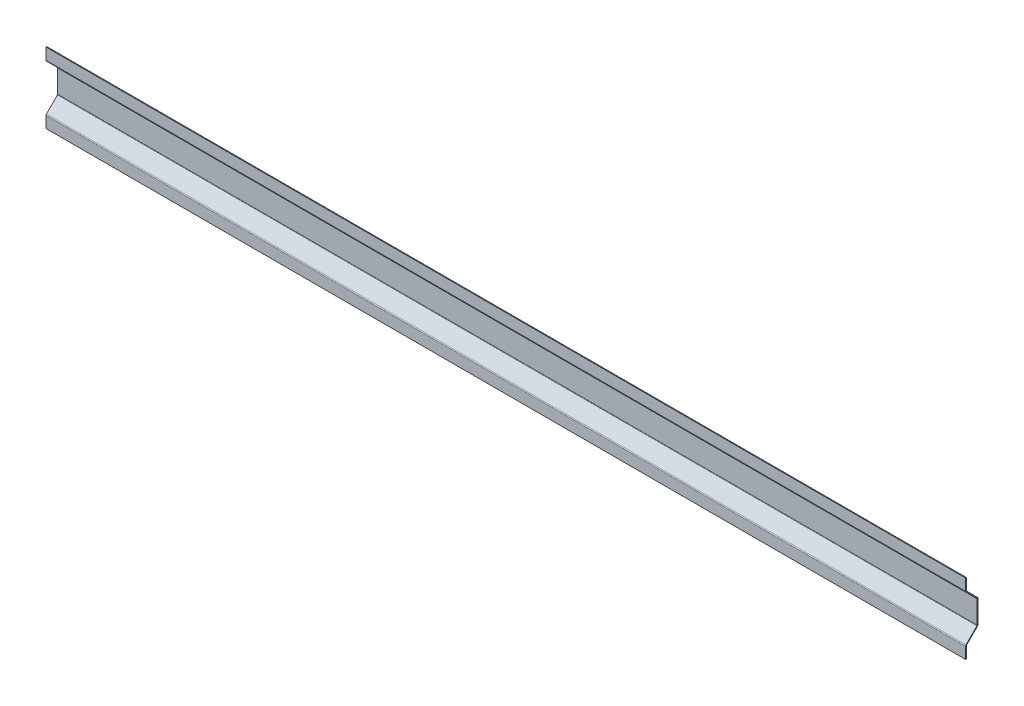
ISO-10303-21;
HEADER;
FILE_DESCRIPTION(('STEP AP214'),'2;1');
FILE_NAME('part.step','',(''),(''),'','','');
FILE_SCHEMA(('AUTOMOTIVE_DESIGN { 1 0 10303 214 1 1 1 1 }'));
ENDSEC;
DATA;
#1=APPLICATION_CONTEXT('core data for automotive mechanical design processes');
#2=APPLICATION_PROTOCOL_DEFINITION('international standard','automotive_design',2000,#1);
#3=PRODUCT_CONTEXT('',#1,'mechanical');
#4=PRODUCT('Part','Part','',(#3));
#5=PRODUCT_RELATED_PRODUCT_CATEGORY('part','',(#4));
#6=PRODUCT_DEFINITION_FORMATION('','',#4);
#7=PRODUCT_DEFINITION_CONTEXT('part definition',#1,'design');
#8=PRODUCT_DEFINITION('design','',#6,#7);
#9=PRODUCT_DEFINITION_SHAPE('','',#8);
#10=(LENGTH_UNIT() NAMED_UNIT(*) SI_UNIT(.MILLI.,.METRE.));
#11=(NAMED_UNIT(*) PLANE_ANGLE_UNIT() SI_UNIT($,.RADIAN.));
#12=(NAMED_UNIT(*) SI_UNIT($,.STERADIAN.) SOLID_ANGLE_UNIT());
#13=UNCERTAINTY_MEASURE_WITH_UNIT(LENGTH_MEASURE(1.E-05),#10,'distance_accuracy_value','');
#14=(GEOMETRIC_REPRESENTATION_CONTEXT(3) GLOBAL_UNCERTAINTY_ASSIGNED_CONTEXT((#13)) GLOBAL_UNIT_ASSIGNED_CONTEXT((#10,
#11,#12)) REPRESENTATION_CONTEXT('',''));
#15=CARTESIAN_POINT('',(0.,0.,0.));
#16=DIRECTION('',(0.,0.,1.));
#17=DIRECTION('',(1.,0.,0.));
#18=AXIS2_PLACEMENT_3D('',#15,#16,#17);
#19=CARTESIAN_POINT('',(575.,-30.5563491861042,14.5563491861037));
#20=DIRECTION('',(-1.,0.,0.));
#21=DIRECTION('',(0.,0.,1.));
#22=AXIS2_PLACEMENT_3D('',#19,#20,#21);
#23=PLANE('',#22);
#24=DIRECTION('',(0.,0.707106781186545,0.70710678118655));
#25=VECTOR('',#24,1.);
#26=CARTESIAN_POINT('',(575.,-29.2634559672906,13.2634559672902));
#27=LINE('',#26,#25);
#28=CARTESIAN_POINT('',(575.,-29.2634559672906,13.2634559672902));
#29=VERTEX_POINT('',#28);
#30=CARTESIAN_POINT('',(575.,-28.5563491861042,13.9705627484767));
#31=VERTEX_POINT('',#30);
#32=EDGE_CURVE('E310',#29,#31,#27,.T.);
#33=ORIENTED_EDGE('',*,*,#32,.F.);
#34=DIRECTION('',(0.,-0.707106781186551,0.707106781186544));
#35=VECTOR('',#34,1.);
#36=CARTESIAN_POINT('',(575.,-7.29289321881343,-8.7071067811868));
#37=LINE('',#36,#35);
#38=CARTESIAN_POINT('',(575.,-15.585786437627,-0.414213562373367));
#39=VERTEX_POINT('',#38);
#40=EDGE_CURVE('E412',#39,#29,#37,.T.);
#41=ORIENTED_EDGE('',*,*,#40,.F.);
#42=DIRECTION('',(0.,0.707106781186544,0.707106781186551));
#43=VECTOR('',#42,1.);
#44=CARTESIAN_POINT('',(575.,-14.8786796564404,0.292893218813095));
#45=LINE('',#44,#43);
#46=CARTESIAN_POINT('',(575.,-14.8786796564404,0.292893218813206));
#47=VERTEX_POINT('',#46);
#48=EDGE_CURVE('E423',#47,#39,#45,.F.);
#49=ORIENTED_EDGE('',*,*,#48,.F.);
#50=DIRECTION('',(0.,0.707106781186551,-0.707106781186544));
#51=VECTOR('',#50,1.);
#52=CARTESIAN_POINT('',(575.,-29.8492424049176,15.2634559672902));
#53=LINE('',#52,#51);
#54=EDGE_CURVE('E417',#47,#31,#53,.F.);
#55=ORIENTED_EDGE('',*,*,#54,.T.);
#56=EDGE_LOOP('',(#33,#41,#49,#55));
#57=FACE_BOUND('',#56,.T.);
#58=ADVANCED_FACE('F114',(#57),#23,.F.);
#59=CARTESIAN_POINT('',(-575.,-15.2928932188138,-0.707106781186573));
#60=DIRECTION('',(1.,0.,0.));
#61=DIRECTION('',(0.,0.,-1.));
#62=AXIS2_PLACEMENT_3D('',#59,#60,#61);
#63=PLANE('',#62);
#64=DIRECTION('',(0.,0.707106781186545,0.70710678118655));
#65=VECTOR('',#64,1.);
#66=CARTESIAN_POINT('',(-575.,-29.2634559672909,13.2634559672905));
#67=LINE('',#66,#65);
#68=CARTESIAN_POINT('',(-575.,-29.2634559672909,13.2634559672905));
#69=VERTEX_POINT('',#68);
#70=CARTESIAN_POINT('',(-575.,-28.5563491861044,13.970562748477));
#71=VERTEX_POINT('',#70);
#72=EDGE_CURVE('E299',#69,#71,#67,.T.);
#73=ORIENTED_EDGE('',*,*,#72,.T.);
#74=DIRECTION('',(0.,-0.707106781186551,0.707106781186544));
#75=VECTOR('',#74,1.);
#76=CARTESIAN_POINT('',(-575.,-14.5857864376272,0.));
#77=LINE('',#76,#75);
#78=CARTESIAN_POINT('',(-575.,-14.8786796564406,0.292893218813428));
#79=VERTEX_POINT('',#78);
#80=EDGE_CURVE('E415',#71,#79,#77,.F.);
#81=ORIENTED_EDGE('',*,*,#80,.T.);
#82=DIRECTION('',(0.,0.707106781186544,0.707106781186551));
#83=VECTOR('',#82,1.);
#84=CARTESIAN_POINT('',(-575.,-15.5857864376272,-0.414213562373145));
#85=LINE('',#84,#83);
#86=CARTESIAN_POINT('',(-575.,-15.5857864376272,-0.414213562373145));
#87=VERTEX_POINT('',#86);
#88=EDGE_CURVE('E406',#79,#87,#85,.F.);
#89=ORIENTED_EDGE('',*,*,#88,.T.);
#90=DIRECTION('',(0.,0.707106781186551,-0.707106781186544));
#91=VECTOR('',#90,1.);
#92=CARTESIAN_POINT('',(-575.,-7.29289321881366,-8.70710678118658));
#93=LINE('',#92,#91);
#94=EDGE_CURVE('E409',#69,#87,#93,.T.);
#95=ORIENTED_EDGE('',*,*,#94,.F.);
#96=EDGE_LOOP('',(#73,#81,#89,#95));
#97=FACE_BOUND('',#96,.T.);
#98=ADVANCED_FACE('F533',(#97),#63,.F.);
#99=CARTESIAN_POINT('',(0.,-7.29289321881332,-8.70710678118658));
#100=DIRECTION('',(0.,0.707106781186544,0.707106781186551));
#101=DIRECTION('',(0.,-0.707106781186551,0.707106781186544));
#102=AXIS2_PLACEMENT_3D('',#99,#100,#101);
#103=PLANE('',#102);
#104=DIRECTION('',(-1.,0.,0.));
#105=VECTOR('',#104,1.);
#106=CARTESIAN_POINT('',(-575.,-29.2634559672909,13.2634559672905));
#107=LINE('',#106,#105);
#108=EDGE_CURVE('E305',#69,#29,#107,.F.);
#109=ORIENTED_EDGE('',*,*,#108,.F.);
#110=ORIENTED_EDGE('',*,*,#94,.T.);
#111=DIRECTION('',(1.,0.,0.));
#112=VECTOR('',#111,1.);
#113=CARTESIAN_POINT('',(-575.,-15.5857864376272,-0.414213562373145));
#114=LINE('',#113,#112);
#115=EDGE_CURVE('E420',#39,#87,#114,.F.);
#116=ORIENTED_EDGE('',*,*,#115,.F.);
#117=ORIENTED_EDGE('',*,*,#40,.T.);
#118=EDGE_LOOP('',(#109,#110,#116,#117));
#119=FACE_BOUND('',#118,.T.);
#120=ADVANCED_FACE('F487',(#119),#103,.F.);
#121=CARTESIAN_POINT('',(0.,-6.58578643762686,-8.00000000000001));
#122=DIRECTION('',(0.,0.707106781186544,0.707106781186551));
#123=DIRECTION('',(0.,-0.707106781186551,0.707106781186544));
#124=AXIS2_PLACEMENT_3D('',#121,#122,#123);
#125=PLANE('',#124);
#126=ORIENTED_EDGE('',*,*,#80,.F.);
#127=DIRECTION('',(-1.,0.,0.));
#128=VECTOR('',#127,1.);
#129=CARTESIAN_POINT('',(-575.,-28.5563491861044,13.970562748477));
#130=LINE('',#129,#128);
#131=EDGE_CURVE('E294',#71,#31,#130,.F.);
#132=ORIENTED_EDGE('',*,*,#131,.T.);
#133=ORIENTED_EDGE('',*,*,#54,.F.);
#134=DIRECTION('',(1.,0.,0.));
#135=VECTOR('',#134,1.);
#136=CARTESIAN_POINT('',(-575.,-14.8786796564406,0.292893218813428));
#137=LINE('',#136,#135);
#138=EDGE_CURVE('E426',#79,#47,#137,.T.);
#139=ORIENTED_EDGE('',*,*,#138,.F.);
#140=EDGE_LOOP('',(#126,#132,#133,#139));
#141=FACE_BOUND('',#140,.T.);
#142=ADVANCED_FACE('F477',(#141),#125,.T.);
#143=CARTESIAN_POINT('',(575.,15.2928932188134,-0.707106781186795));
#144=DIRECTION('',(-1.,0.,0.));
#145=DIRECTION('',(0.,0.,1.));
#146=AXIS2_PLACEMENT_3D('',#143,#144,#145);
#147=PLANE('',#146);
#148=DIRECTION('',(0.,-0.707106781186545,0.70710678118655));
#149=VECTOR('',#148,1.);
#150=CARTESIAN_POINT('',(575.,29.2634559672906,13.2634559672902));
#151=LINE('',#150,#149);
#152=CARTESIAN_POINT('',(575.,29.2634559672906,13.2634559672902));
#153=VERTEX_POINT('',#152);
#154=CARTESIAN_POINT('',(575.,28.5563491861041,13.9705627484767));
#155=VERTEX_POINT('',#154);
#156=EDGE_CURVE('E350',#153,#155,#151,.T.);
#157=ORIENTED_EDGE('',*,*,#156,.T.);
#158=DIRECTION('',(0.,0.707106781186551,0.707106781186544));
#159=VECTOR('',#158,1.);
#160=CARTESIAN_POINT('',(575.,14.5857864376269,-3.33066907387547E-13));
#161=LINE('',#160,#159);
#162=CARTESIAN_POINT('',(575.,14.8786796564403,0.292893218813206));
#163=VERTEX_POINT('',#162);
#164=EDGE_CURVE('E374',#155,#163,#161,.F.);
#165=ORIENTED_EDGE('',*,*,#164,.T.);
#166=DIRECTION('',(0.,-0.707106781186544,0.707106781186551));
#167=VECTOR('',#166,1.);
#168=CARTESIAN_POINT('',(575.,15.5857864376269,-0.414213562373367));
#169=LINE('',#168,#167);
#170=CARTESIAN_POINT('',(575.,15.5857864376269,-0.414213562373367));
#171=VERTEX_POINT('',#170);
#172=EDGE_CURVE('E362',#163,#171,#169,.F.);
#173=ORIENTED_EDGE('',*,*,#172,.T.);
#174=DIRECTION('',(0.,-0.707106781186551,-0.707106781186544));
#175=VECTOR('',#174,1.);
#176=CARTESIAN_POINT('',(575.,7.29289321881332,-8.7071067811868));
#177=LINE('',#176,#175);
#178=EDGE_CURVE('E369',#153,#171,#177,.T.);
#179=ORIENTED_EDGE('',*,*,#178,.F.);
#180=EDGE_LOOP('',(#157,#165,#173,#179));
#181=FACE_BOUND('',#180,.T.);
#182=ADVANCED_FACE('F838',(#181),#147,.F.);
#183=CARTESIAN_POINT('',(-575.,30.5563491861038,14.5563491861039));
#184=DIRECTION('',(1.,0.,0.));
#185=DIRECTION('',(0.,0.,-1.));
#186=AXIS2_PLACEMENT_3D('',#183,#184,#185);
#187=PLANE('',#186);
#188=DIRECTION('',(0.,-0.707106781186545,0.70710678118655));
#189=VECTOR('',#188,1.);
#190=CARTESIAN_POINT('',(-575.,29.2634559672903,13.2634559672905));
#191=LINE('',#190,#189);
#192=CARTESIAN_POINT('',(-575.,29.2634559672903,13.2634559672905));
#193=VERTEX_POINT('',#192);
#194=CARTESIAN_POINT('',(-575.,28.5563491861038,13.970562748477));
#195=VERTEX_POINT('',#194);
#196=EDGE_CURVE('E360',#193,#195,#191,.T.);
#197=ORIENTED_EDGE('',*,*,#196,.F.);
#198=DIRECTION('',(0.,0.707106781186551,0.707106781186544));
#199=VECTOR('',#198,1.);
#200=CARTESIAN_POINT('',(-575.,7.2928932188131,-8.70710678118658));
#201=LINE('',#200,#199);
#202=CARTESIAN_POINT('',(-575.,15.5857864376266,-0.414213562373145));
#203=VERTEX_POINT('',#202);
#204=EDGE_CURVE('E365',#203,#193,#201,.T.);
#205=ORIENTED_EDGE('',*,*,#204,.F.);
#206=DIRECTION('',(0.,-0.707106781186544,0.707106781186551));
#207=VECTOR('',#206,1.);
#208=CARTESIAN_POINT('',(-575.,14.8786796564401,0.292893218813428));
#209=LINE('',#208,#207);
#210=CARTESIAN_POINT('',(-575.,14.8786796564401,0.292893218813428));
#211=VERTEX_POINT('',#210);
#212=EDGE_CURVE('E379',#211,#203,#209,.F.);
#213=ORIENTED_EDGE('',*,*,#212,.F.);
#214=DIRECTION('',(0.,-0.707106781186551,-0.707106781186544));
#215=VECTOR('',#214,1.);
#216=CARTESIAN_POINT('',(-575.,29.8492424049173,15.2634559672905));
#217=LINE('',#216,#215);
#218=EDGE_CURVE('E371',#211,#195,#217,.F.);
#219=ORIENTED_EDGE('',*,*,#218,.T.);
#220=EDGE_LOOP('',(#197,#205,#213,#219));
#221=FACE_BOUND('',#220,.T.);
#222=ADVANCED_FACE('F511',(#221),#187,.F.);
#223=CARTESIAN_POINT('',(0.,7.29289321881332,-8.70710678118658));
#224=DIRECTION('',(0.,-0.707106781186544,0.707106781186551));
#225=DIRECTION('',(0.,-0.707106781186551,-0.707106781186544));
#226=AXIS2_PLACEMENT_3D('',#223,#224,#225);
#227=PLANE('',#226);
#228=DIRECTION('',(1.,0.,0.));
#229=VECTOR('',#228,1.);
#230=CARTESIAN_POINT('',(575.,29.2634559672906,13.2634559672902));
#231=LINE('',#230,#229);
#232=EDGE_CURVE('E356',#153,#193,#231,.F.);
#233=ORIENTED_EDGE('',*,*,#232,.F.);
#234=ORIENTED_EDGE('',*,*,#178,.T.);
#235=DIRECTION('',(-1.,0.,0.));
#236=VECTOR('',#235,1.);
#237=CARTESIAN_POINT('',(575.,15.5857864376269,-0.414213562373367));
#238=LINE('',#237,#236);
#239=EDGE_CURVE('E376',#203,#171,#238,.F.);
#240=ORIENTED_EDGE('',*,*,#239,.F.);
#241=ORIENTED_EDGE('',*,*,#204,.T.);
#242=EDGE_LOOP('',(#233,#234,#240,#241));
#243=FACE_BOUND('',#242,.T.);
#244=ADVANCED_FACE('F518',(#243),#227,.F.);
#245=CARTESIAN_POINT('',(0.,6.58578643762686,-8.00000000000001));
#246=DIRECTION('',(0.,-0.707106781186544,0.707106781186551));
#247=DIRECTION('',(0.,-0.707106781186551,-0.707106781186544));
#248=AXIS2_PLACEMENT_3D('',#245,#246,#247);
#249=PLANE('',#248);
#250=ORIENTED_EDGE('',*,*,#164,.F.);
#251=DIRECTION('',(1.,0.,0.));
#252=VECTOR('',#251,1.);
#253=CARTESIAN_POINT('',(575.,28.5563491861041,13.9705627484767));
#254=LINE('',#253,#252);
#255=EDGE_CURVE('E345',#155,#195,#254,.F.);
#256=ORIENTED_EDGE('',*,*,#255,.T.);
#257=ORIENTED_EDGE('',*,*,#218,.F.);
#258=DIRECTION('',(-1.,0.,0.));
#259=VECTOR('',#258,1.);
#260=CARTESIAN_POINT('',(575.,14.8786796564403,0.292893218813206));
#261=LINE('',#260,#259);
#262=EDGE_CURVE('E382',#163,#211,#261,.T.);
#263=ORIENTED_EDGE('',*,*,#262,.F.);
#264=EDGE_LOOP('',(#250,#256,#257,#263));
#265=FACE_BOUND('',#264,.T.);
#266=ADVANCED_FACE('F507',(#265),#249,.T.);
#267=CARTESIAN_POINT('',(0.,0.,-1.));
#268=DIRECTION('',(0.,0.,-1.));
#269=DIRECTION('',(-1.,0.,0.));
#270=AXIS2_PLACEMENT_3D('',#267,#268,#269);
#271=PLANE('',#270);
#272=DIRECTION('',(0.,-1.,0.));
#273=VECTOR('',#272,1.);
#274=CARTESIAN_POINT('',(-575.,-16.0000000000002,-1.));
#275=LINE('',#274,#273);
#276=CARTESIAN_POINT('',(-575.,14.1715728752535,-1.));
#277=VERTEX_POINT('',#276);
#278=CARTESIAN_POINT('',(-575.,-14.1715728752541,-1.));
#279=VERTEX_POINT('',#278);
#280=EDGE_CURVE('E13',#277,#279,#275,.T.);
#281=ORIENTED_EDGE('',*,*,#280,.F.);
#282=DIRECTION('',(-1.,0.,0.));
#283=VECTOR('',#282,1.);
#284=CARTESIAN_POINT('',(-575.,14.1715728752535,-1.));
#285=LINE('',#284,#283);
#286=CARTESIAN_POINT('',(575.,14.1715728752537,-1.00000000000033));
#287=VERTEX_POINT('',#286);
#288=EDGE_CURVE('E386',#277,#287,#285,.F.);
#289=ORIENTED_EDGE('',*,*,#288,.T.);
#290=DIRECTION('',(0.,1.,0.));
#291=VECTOR('',#290,1.);
#292=CARTESIAN_POINT('',(575.,-16.,-1.00000000000033));
#293=LINE('',#292,#291);
#294=CARTESIAN_POINT('',(575.,-14.1715728752538,-1.00000000000033));
#295=VERTEX_POINT('',#294);
#296=EDGE_CURVE('E123',#295,#287,#293,.T.);
#297=ORIENTED_EDGE('',*,*,#296,.F.);
#298=DIRECTION('',(1.,0.,0.));
#299=VECTOR('',#298,1.);
#300=CARTESIAN_POINT('',(575.,-14.1715728752538,-1.00000000000033));
#301=LINE('',#300,#299);
#302=EDGE_CURVE('E430',#295,#279,#301,.F.);
#303=ORIENTED_EDGE('',*,*,#302,.T.);
#304=EDGE_LOOP('',(#281,#289,#297,#303));
#305=FACE_BOUND('',#304,.T.);
#306=ADVANCED_FACE('F493',(#305),#271,.T.);
#307=CARTESIAN_POINT('',(0.,0.,0.));
#308=DIRECTION('',(0.,0.,-1.));
#309=DIRECTION('',(-1.,0.,0.));
#310=AXIS2_PLACEMENT_3D('',#307,#308,#309);
#311=PLANE('',#310);
#312=DIRECTION('',(-1.,0.,0.));
#313=VECTOR('',#312,1.);
#314=CARTESIAN_POINT('',(-575.,14.1715728752535,0.));
#315=LINE('',#314,#313);
#316=CARTESIAN_POINT('',(-575.,14.1715728752535,0.));
#317=VERTEX_POINT('',#316);
#318=CARTESIAN_POINT('',(575.,14.1715728752537,-3.33066907387547E-13));
#319=VERTEX_POINT('',#318);
#320=EDGE_CURVE('E399',#317,#319,#315,.F.);
#321=ORIENTED_EDGE('',*,*,#320,.F.);
#322=DIRECTION('',(0.,-1.,0.));
#323=VECTOR('',#322,1.);
#324=CARTESIAN_POINT('',(-575.,-16.0000000000002,0.));
#325=LINE('',#324,#323);
#326=CARTESIAN_POINT('',(-575.,-14.1715728752541,0.));
#327=VERTEX_POINT('',#326);
#328=EDGE_CURVE('E118',#317,#327,#325,.T.);
#329=ORIENTED_EDGE('',*,*,#328,.T.);
#330=DIRECTION('',(1.,0.,0.));
#331=VECTOR('',#330,1.);
#332=CARTESIAN_POINT('',(575.,-14.1715728752538,-3.33066907387547E-13));
#333=LINE('',#332,#331);
#334=CARTESIAN_POINT('',(575.,-14.1715728752538,-3.33066907387547E-13));
#335=VERTEX_POINT('',#334);
#336=EDGE_CURVE('E443',#335,#327,#333,.F.);
#337=ORIENTED_EDGE('',*,*,#336,.F.);
#338=DIRECTION('',(0.,1.,0.));
#339=VECTOR('',#338,1.);
#340=CARTESIAN_POINT('',(575.,-16.,-3.33066907387547E-13));
#341=LINE('',#340,#339);
#342=EDGE_CURVE('E450',#335,#319,#341,.T.);
#343=ORIENTED_EDGE('',*,*,#342,.T.);
#344=EDGE_LOOP('',(#321,#329,#337,#343));
#345=FACE_BOUND('',#344,.T.);
#346=ADVANCED_FACE('F462',(#345),#311,.F.);
#347=CARTESIAN_POINT('',(-575.,-16.0000000000002,-1.));
#348=DIRECTION('',(-1.,0.,0.));
#349=DIRECTION('',(0.,0.,1.));
#350=AXIS2_PLACEMENT_3D('',#347,#348,#349);
#351=PLANE('',#350);
#352=ORIENTED_EDGE('',*,*,#328,.F.);
#353=DIRECTION('',(0.,0.,-1.));
#354=VECTOR('',#353,1.);
#355=CARTESIAN_POINT('',(-575.,14.1715728752535,0.));
#356=LINE('',#355,#354);
#357=EDGE_CURVE('E393',#317,#277,#356,.T.);
#358=ORIENTED_EDGE('',*,*,#357,.T.);
#359=ORIENTED_EDGE('',*,*,#280,.T.);
#360=DIRECTION('',(0.,0.,-1.));
#361=VECTOR('',#360,1.);
#362=CARTESIAN_POINT('',(-575.,-14.1715728752541,0.));
#363=LINE('',#362,#361);
#364=EDGE_CURVE('E447',#327,#279,#363,.T.);
#365=ORIENTED_EDGE('',*,*,#364,.F.);
#366=EDGE_LOOP('',(#352,#358,#359,#365));
#367=FACE_BOUND('',#366,.T.);
#368=ADVANCED_FACE('F464',(#367),#351,.T.);
#369=CARTESIAN_POINT('',(575.,-16.,-1.00000000000033));
#370=DIRECTION('',(1.,0.,0.));
#371=DIRECTION('',(0.,0.,-1.));
#372=AXIS2_PLACEMENT_3D('',#369,#370,#371);
#373=PLANE('',#372);
#374=DIRECTION('',(0.,0.,-1.));
#375=VECTOR('',#374,1.);
#376=CARTESIAN_POINT('',(575.,14.1715728752537,-3.33066907387547E-13));
#377=LINE('',#376,#375);
#378=EDGE_CURVE('E403',#319,#287,#377,.T.);
#379=ORIENTED_EDGE('',*,*,#378,.F.);
#380=ORIENTED_EDGE('',*,*,#342,.F.);
#381=DIRECTION('',(0.,0.,-1.));
#382=VECTOR('',#381,1.);
#383=CARTESIAN_POINT('',(575.,-14.1715728752538,-3.33066907387547E-13));
#384=LINE('',#383,#382);
#385=EDGE_CURVE('E437',#335,#295,#384,.T.);
#386=ORIENTED_EDGE('',*,*,#385,.T.);
#387=ORIENTED_EDGE('',*,*,#296,.T.);
#388=EDGE_LOOP('',(#379,#380,#386,#387));
#389=FACE_BOUND('',#388,.T.);
#390=ADVANCED_FACE('F116',(#389),#373,.T.);
#391=CARTESIAN_POINT('',(-575.,-14.1715728752541,1.));
#392=DIRECTION('',(-1.,0.,0.));
#393=DIRECTION('',(0.,0.,1.));
#394=AXIS2_PLACEMENT_3D('',#391,#392,#393);
#395=PLANE('',#394);
#396=ORIENTED_EDGE('',*,*,#88,.F.);
#397=CARTESIAN_POINT('',(-575.,-14.1715728752541,1.));
#398=DIRECTION('',(1.,0.,0.));
#399=DIRECTION('',(0.,0.,-1.));
#400=AXIS2_PLACEMENT_3D('',#397,#398,#399);
#401=CIRCLE('',#400,0.999999999999999);
#402=EDGE_CURVE('E440',#327,#79,#401,.F.);
#403=ORIENTED_EDGE('',*,*,#402,.F.);
#404=ORIENTED_EDGE('',*,*,#364,.T.);
#405=CARTESIAN_POINT('',(-575.,-14.1715728752541,1.));
#406=DIRECTION('',(1.,0.,0.));
#407=DIRECTION('',(0.,0.,-1.));
#408=AXIS2_PLACEMENT_3D('',#405,#406,#407);
#409=CIRCLE('',#408,2.);
#410=EDGE_CURVE('E433',#279,#87,#409,.F.);
#411=ORIENTED_EDGE('',*,*,#410,.T.);
#412=EDGE_LOOP('',(#396,#403,#404,#411));
#413=FACE_BOUND('',#412,.T.);
#414=ADVANCED_FACE('F469',(#413),#395,.T.);
#415=CARTESIAN_POINT('',(575.,-14.1715728752538,0.999999999999668));
#416=DIRECTION('',(-1.,0.,0.));
#417=DIRECTION('',(0.,0.,1.));
#418=AXIS2_PLACEMENT_3D('',#415,#416,#417);
#419=PLANE('',#418);
#420=CARTESIAN_POINT('',(575.,-14.1715728752538,0.999999999999668));
#421=DIRECTION('',(1.,0.,0.));
#422=DIRECTION('',(0.,0.,-1.));
#423=AXIS2_PLACEMENT_3D('',#420,#421,#422);
#424=CIRCLE('',#423,0.999999999999999);
#425=EDGE_CURVE('E411',#47,#335,#424,.T.);
#426=ORIENTED_EDGE('',*,*,#425,.F.);
#427=ORIENTED_EDGE('',*,*,#48,.T.);
#428=CARTESIAN_POINT('',(575.,-14.1715728752538,0.999999999999668));
#429=DIRECTION('',(1.,0.,0.));
#430=DIRECTION('',(0.,0.,-1.));
#431=AXIS2_PLACEMENT_3D('',#428,#429,#430);
#432=CIRCLE('',#431,2.);
#433=EDGE_CURVE('E434',#39,#295,#432,.T.);
#434=ORIENTED_EDGE('',*,*,#433,.T.);
#435=ORIENTED_EDGE('',*,*,#385,.F.);
#436=EDGE_LOOP('',(#426,#427,#434,#435));
#437=FACE_BOUND('',#436,.T.);
#438=ADVANCED_FACE('F484',(#437),#419,.F.);
#439=CARTESIAN_POINT('',(575.,-14.1715728752538,0.999999999999668));
#440=DIRECTION('',(1.,0.,0.));
#441=DIRECTION('',(0.,-0.707106781186544,-0.707106781186551));
#442=AXIS2_PLACEMENT_3D('',#439,#440,#441);
#443=CYLINDRICAL_SURFACE('',#442,2.);
#444=ORIENTED_EDGE('',*,*,#302,.F.);
#445=ORIENTED_EDGE('',*,*,#433,.F.);
#446=ORIENTED_EDGE('',*,*,#115,.T.);
#447=ORIENTED_EDGE('',*,*,#410,.F.);
#448=EDGE_LOOP('',(#444,#445,#446,#447));
#449=FACE_BOUND('',#448,.T.);
#450=ADVANCED_FACE('F490',(#449),#443,.T.);
#451=CARTESIAN_POINT('',(575.,-14.1715728752538,0.999999999999668));
#452=DIRECTION('',(1.,0.,0.));
#453=DIRECTION('',(0.,-0.707106781186544,-0.707106781186551));
#454=AXIS2_PLACEMENT_3D('',#451,#452,#453);
#455=CYLINDRICAL_SURFACE('',#454,0.999999999999999);
#456=ORIENTED_EDGE('',*,*,#336,.T.);
#457=ORIENTED_EDGE('',*,*,#402,.T.);
#458=ORIENTED_EDGE('',*,*,#138,.T.);
#459=ORIENTED_EDGE('',*,*,#425,.T.);
#460=EDGE_LOOP('',(#456,#457,#458,#459));
#461=FACE_BOUND('',#460,.T.);
#462=ADVANCED_FACE('F472',(#461),#455,.F.);
#463=CARTESIAN_POINT('',(575.,14.1715728752537,0.999999999999668));
#464=DIRECTION('',(1.,0.,0.));
#465=DIRECTION('',(0.,0.,-1.));
#466=AXIS2_PLACEMENT_3D('',#463,#464,#465);
#467=PLANE('',#466);
#468=ORIENTED_EDGE('',*,*,#172,.F.);
#469=CARTESIAN_POINT('',(575.,14.1715728752537,0.999999999999668));
#470=DIRECTION('',(-1.,0.,0.));
#471=DIRECTION('',(0.,0.,1.));
#472=AXIS2_PLACEMENT_3D('',#469,#470,#471);
#473=CIRCLE('',#472,0.999999999999999);
#474=EDGE_CURVE('E396',#319,#163,#473,.F.);
#475=ORIENTED_EDGE('',*,*,#474,.F.);
#476=ORIENTED_EDGE('',*,*,#378,.T.);
#477=CARTESIAN_POINT('',(575.,14.1715728752537,0.999999999999668));
#478=DIRECTION('',(-1.,0.,0.));
#479=DIRECTION('',(0.,0.,1.));
#480=AXIS2_PLACEMENT_3D('',#477,#478,#479);
#481=CIRCLE('',#480,2.);
#482=EDGE_CURVE('E389',#287,#171,#481,.F.);
#483=ORIENTED_EDGE('',*,*,#482,.T.);
#484=EDGE_LOOP('',(#468,#475,#476,#483));
#485=FACE_BOUND('',#484,.T.);
#486=ADVANCED_FACE('F499',(#485),#467,.T.);
#487=CARTESIAN_POINT('',(-575.,14.1715728752535,1.));
#488=DIRECTION('',(1.,0.,0.));
#489=DIRECTION('',(0.,0.,-1.));
#490=AXIS2_PLACEMENT_3D('',#487,#488,#489);
#491=PLANE('',#490);
#492=CARTESIAN_POINT('',(-575.,14.1715728752535,1.));
#493=DIRECTION('',(-1.,0.,0.));
#494=DIRECTION('',(0.,0.,1.));
#495=AXIS2_PLACEMENT_3D('',#492,#493,#494);
#496=CIRCLE('',#495,0.999999999999999);
#497=EDGE_CURVE('E368',#211,#317,#496,.T.);
#498=ORIENTED_EDGE('',*,*,#497,.F.);
#499=ORIENTED_EDGE('',*,*,#212,.T.);
#500=CARTESIAN_POINT('',(-575.,14.1715728752535,1.));
#501=DIRECTION('',(-1.,0.,0.));
#502=DIRECTION('',(0.,0.,1.));
#503=AXIS2_PLACEMENT_3D('',#500,#501,#502);
#504=CIRCLE('',#503,2.);
#505=EDGE_CURVE('E390',#203,#277,#504,.T.);
#506=ORIENTED_EDGE('',*,*,#505,.T.);
#507=ORIENTED_EDGE('',*,*,#357,.F.);
#508=EDGE_LOOP('',(#498,#499,#506,#507));
#509=FACE_BOUND('',#508,.T.);
#510=ADVANCED_FACE('F515',(#509),#491,.F.);
#511=CARTESIAN_POINT('',(-575.,14.1715728752535,1.));
#512=DIRECTION('',(-1.,0.,0.));
#513=DIRECTION('',(0.,0.707106781186544,-0.707106781186551));
#514=AXIS2_PLACEMENT_3D('',#511,#512,#513);
#515=CYLINDRICAL_SURFACE('',#514,2.);
#516=ORIENTED_EDGE('',*,*,#288,.F.);
#517=ORIENTED_EDGE('',*,*,#505,.F.);
#518=ORIENTED_EDGE('',*,*,#239,.T.);
#519=ORIENTED_EDGE('',*,*,#482,.F.);
#520=EDGE_LOOP('',(#516,#517,#518,#519));
#521=FACE_BOUND('',#520,.T.);
#522=ADVANCED_FACE('F521',(#521),#515,.T.);
#523=CARTESIAN_POINT('',(-575.,14.1715728752535,1.));
#524=DIRECTION('',(-1.,0.,0.));
#525=DIRECTION('',(0.,0.707106781186544,-0.707106781186551));
#526=AXIS2_PLACEMENT_3D('',#523,#524,#525);
#527=CYLINDRICAL_SURFACE('',#526,0.999999999999999);
#528=ORIENTED_EDGE('',*,*,#320,.T.);
#529=ORIENTED_EDGE('',*,*,#474,.T.);
#530=ORIENTED_EDGE('',*,*,#262,.T.);
#531=ORIENTED_EDGE('',*,*,#497,.T.);
#532=EDGE_LOOP('',(#528,#529,#530,#531));
#533=FACE_BOUND('',#532,.T.);
#534=ADVANCED_FACE('F502',(#533),#527,.F.);
#535=CARTESIAN_POINT('',(-575.,29.9705627484769,12.5563491861039));
#536=DIRECTION('',(-1.,0.,0.));
#537=DIRECTION('',(0.,0.,1.));
#538=AXIS2_PLACEMENT_3D('',#535,#536,#537);
#539=PLANE('',#538);
#540=DIRECTION('',(0.,0.,-1.));
#541=VECTOR('',#540,1.);
#542=CARTESIAN_POINT('',(-575.,29.9705627484769,14.5563491861039));
#543=LINE('',#542,#541);
#544=CARTESIAN_POINT('',(-575.,29.9705627484769,13.5563491861039));
#545=VERTEX_POINT('',#544);
#546=CARTESIAN_POINT('',(-575.,29.9705627484769,14.5563491861039));
#547=VERTEX_POINT('',#546);
#548=EDGE_CURVE('E312',#545,#547,#543,.F.);
#549=ORIENTED_EDGE('',*,*,#548,.F.);
#550=CARTESIAN_POINT('',(-575.,29.9705627484769,12.5563491861039));
#551=DIRECTION('',(1.,0.,0.));
#552=DIRECTION('',(0.,0.,-1.));
#553=AXIS2_PLACEMENT_3D('',#550,#551,#552);
#554=CIRCLE('',#553,0.999999999999999);
#555=EDGE_CURVE('E353',#193,#545,#554,.F.);
#556=ORIENTED_EDGE('',*,*,#555,.F.);
#557=ORIENTED_EDGE('',*,*,#196,.T.);
#558=CARTESIAN_POINT('',(-575.,29.9705627484769,12.5563491861039));
#559=DIRECTION('',(1.,0.,0.));
#560=DIRECTION('',(0.,0.,-1.));
#561=AXIS2_PLACEMENT_3D('',#558,#559,#560);
#562=CIRCLE('',#561,2.);
#563=EDGE_CURVE('E139',#195,#547,#562,.F.);
#564=ORIENTED_EDGE('',*,*,#563,.T.);
#565=EDGE_LOOP('',(#549,#556,#557,#564));
#566=FACE_BOUND('',#565,.T.);
#567=ADVANCED_FACE('F528',(#566),#539,.T.);
#568=CARTESIAN_POINT('',(575.,29.9705627484771,12.5563491861037));
#569=DIRECTION('',(-1.,0.,0.));
#570=DIRECTION('',(0.,0.,1.));
#571=AXIS2_PLACEMENT_3D('',#568,#569,#570);
#572=PLANE('',#571);
#573=CARTESIAN_POINT('',(575.,29.9705627484771,12.5563491861037));
#574=DIRECTION('',(1.,0.,0.));
#575=DIRECTION('',(0.,0.,-1.));
#576=AXIS2_PLACEMENT_3D('',#573,#574,#575);
#577=CIRCLE('',#576,0.999999999999999);
#578=CARTESIAN_POINT('',(575.,29.9705627484771,13.5563491861037));
#579=VERTEX_POINT('',#578);
#580=EDGE_CURVE('E318',#579,#153,#577,.T.);
#581=ORIENTED_EDGE('',*,*,#580,.F.);
#582=DIRECTION('',(0.,0.,-1.));
#583=VECTOR('',#582,1.);
#584=CARTESIAN_POINT('',(575.,29.9705627484771,13.5563491861037));
#585=LINE('',#584,#583);
#586=CARTESIAN_POINT('',(575.,29.9705627484771,14.5563491861037));
#587=VERTEX_POINT('',#586);
#588=EDGE_CURVE('E338',#579,#587,#585,.F.);
#589=ORIENTED_EDGE('',*,*,#588,.T.);
#590=CARTESIAN_POINT('',(575.,29.9705627484771,12.5563491861037));
#591=DIRECTION('',(1.,0.,0.));
#592=DIRECTION('',(0.,0.,-1.));
#593=AXIS2_PLACEMENT_3D('',#590,#591,#592);
#594=CIRCLE('',#593,2.);
#595=EDGE_CURVE('E348',#587,#155,#594,.T.);
#596=ORIENTED_EDGE('',*,*,#595,.T.);
#597=ORIENTED_EDGE('',*,*,#156,.F.);
#598=EDGE_LOOP('',(#581,#589,#596,#597));
#599=FACE_BOUND('',#598,.T.);
#600=ADVANCED_FACE('F608',(#599),#572,.F.);
#601=CARTESIAN_POINT('',(575.,29.9705627484771,12.5563491861037));
#602=DIRECTION('',(1.,0.,0.));
#603=DIRECTION('',(0.,0.,1.));
#604=AXIS2_PLACEMENT_3D('',#601,#602,#603);
#605=CYLINDRICAL_SURFACE('',#604,2.);
#606=ORIENTED_EDGE('',*,*,#255,.F.);
#607=ORIENTED_EDGE('',*,*,#595,.F.);
#608=DIRECTION('',(1.,0.,0.));
#609=VECTOR('',#608,1.);
#610=CARTESIAN_POINT('',(-575.,29.9705627484769,14.5563491861039));
#611=LINE('',#610,#609);
#612=EDGE_CURVE('E336',#587,#547,#611,.F.);
#613=ORIENTED_EDGE('',*,*,#612,.T.);
#614=ORIENTED_EDGE('',*,*,#563,.F.);
#615=EDGE_LOOP('',(#606,#607,#613,#614));
#616=FACE_BOUND('',#615,.T.);
#617=ADVANCED_FACE('F620',(#616),#605,.T.);
#618=CARTESIAN_POINT('',(575.,29.9705627484771,12.5563491861037));
#619=DIRECTION('',(1.,0.,0.));
#620=DIRECTION('',(0.,0.,1.));
#621=AXIS2_PLACEMENT_3D('',#618,#619,#620);
#622=CYLINDRICAL_SURFACE('',#621,0.999999999999999);
#623=ORIENTED_EDGE('',*,*,#232,.T.);
#624=ORIENTED_EDGE('',*,*,#555,.T.);
#625=DIRECTION('',(1.,0.,0.));
#626=VECTOR('',#625,1.);
#627=CARTESIAN_POINT('',(-575.,29.9705627484769,13.5563491861039));
#628=LINE('',#627,#626);
#629=EDGE_CURVE('E341',#545,#579,#628,.T.);
#630=ORIENTED_EDGE('',*,*,#629,.T.);
#631=ORIENTED_EDGE('',*,*,#580,.T.);
#632=EDGE_LOOP('',(#623,#624,#630,#631));
#633=FACE_BOUND('',#632,.T.);
#634=ADVANCED_FACE('F631',(#633),#622,.F.);
#635=CARTESIAN_POINT('',(575.,44.1421356237309,14.5563491861037));
#636=DIRECTION('',(-1.,0.,0.));
#637=DIRECTION('',(0.,0.,1.));
#638=AXIS2_PLACEMENT_3D('',#635,#636,#637);
#639=PLANE('',#638);
#640=ORIENTED_EDGE('',*,*,#588,.F.);
#641=DIRECTION('',(0.,-1.,0.));
#642=VECTOR('',#641,1.);
#643=CARTESIAN_POINT('',(575.,44.1421356237309,13.5563491861037));
#644=LINE('',#643,#642);
#645=CARTESIAN_POINT('',(575.,44.1421356237309,13.5563491861037));
#646=VERTEX_POINT('',#645);
#647=EDGE_CURVE('E334',#579,#646,#644,.F.);
#648=ORIENTED_EDGE('',*,*,#647,.T.);
#649=DIRECTION('',(0.,0.,-1.));
#650=VECTOR('',#649,1.);
#651=CARTESIAN_POINT('',(575.,44.1421356237309,14.5563491861037));
#652=LINE('',#651,#650);
#653=CARTESIAN_POINT('',(575.,44.1421356237309,14.5563491861037));
#654=VERTEX_POINT('',#653);
#655=EDGE_CURVE('E315',#654,#646,#652,.T.);
#656=ORIENTED_EDGE('',*,*,#655,.F.);
#657=DIRECTION('',(0.,1.,0.));
#658=VECTOR('',#657,1.);
#659=CARTESIAN_POINT('',(575.,-1.,14.5563491861037));
#660=LINE('',#659,#658);
#661=EDGE_CURVE('E327',#587,#654,#660,.T.);
#662=ORIENTED_EDGE('',*,*,#661,.F.);
#663=EDGE_LOOP('',(#640,#648,#656,#662));
#664=FACE_BOUND('',#663,.T.);
#665=ADVANCED_FACE('F641',(#664),#639,.F.);
#666=CARTESIAN_POINT('',(-575.,29.5563491861038,14.5563491861039));
#667=DIRECTION('',(1.,0.,0.));
#668=DIRECTION('',(0.,0.,-1.));
#669=AXIS2_PLACEMENT_3D('',#666,#667,#668);
#670=PLANE('',#669);
#671=ORIENTED_EDGE('',*,*,#548,.T.);
#672=DIRECTION('',(0.,-1.,0.));
#673=VECTOR('',#672,1.);
#674=CARTESIAN_POINT('',(-575.,-1.00000000000033,14.5563491861039));
#675=LINE('',#674,#673);
#676=CARTESIAN_POINT('',(-575.,44.1421356237307,14.5563491861039));
#677=VERTEX_POINT('',#676);
#678=EDGE_CURVE('E322',#677,#547,#675,.T.);
#679=ORIENTED_EDGE('',*,*,#678,.F.);
#680=DIRECTION('',(0.,0.,-1.));
#681=VECTOR('',#680,1.);
#682=CARTESIAN_POINT('',(-575.,44.1421356237307,14.5563491861039));
#683=LINE('',#682,#681);
#684=CARTESIAN_POINT('',(-575.,44.1421356237307,13.5563491861039));
#685=VERTEX_POINT('',#684);
#686=EDGE_CURVE('E319',#677,#685,#683,.T.);
#687=ORIENTED_EDGE('',*,*,#686,.T.);
#688=DIRECTION('',(0.,1.,0.));
#689=VECTOR('',#688,1.);
#690=CARTESIAN_POINT('',(-575.,29.5563491861038,13.5563491861039));
#691=LINE('',#690,#689);
#692=EDGE_CURVE('E329',#685,#545,#691,.F.);
#693=ORIENTED_EDGE('',*,*,#692,.T.);
#694=EDGE_LOOP('',(#671,#679,#687,#693));
#695=FACE_BOUND('',#694,.T.);
#696=ADVANCED_FACE('F652',(#695),#670,.F.);
#697=CARTESIAN_POINT('',(0.,-1.,14.5563491861039));
#698=DIRECTION('',(0.,0.,-1.));
#699=DIRECTION('',(-1.,0.,0.));
#700=AXIS2_PLACEMENT_3D('',#697,#698,#699);
#701=PLANE('',#700);
#702=ORIENTED_EDGE('',*,*,#612,.F.);
#703=ORIENTED_EDGE('',*,*,#661,.T.);
#704=DIRECTION('',(-1.,0.,0.));
#705=VECTOR('',#704,1.);
#706=CARTESIAN_POINT('',(0.,44.142135623731,14.5563491861039));
#707=LINE('',#706,#705);
#708=EDGE_CURVE('E325',#654,#677,#707,.T.);
#709=ORIENTED_EDGE('',*,*,#708,.T.);
#710=ORIENTED_EDGE('',*,*,#678,.T.);
#711=EDGE_LOOP('',(#702,#703,#709,#710));
#712=FACE_BOUND('',#711,.T.);
#713=ADVANCED_FACE('F663',(#712),#701,.F.);
#714=CARTESIAN_POINT('',(0.,-1.,13.5563491861039));
#715=DIRECTION('',(0.,0.,-1.));
#716=DIRECTION('',(-1.,0.,0.));
#717=AXIS2_PLACEMENT_3D('',#714,#715,#716);
#718=PLANE('',#717);
#719=ORIENTED_EDGE('',*,*,#647,.F.);
#720=ORIENTED_EDGE('',*,*,#629,.F.);
#721=ORIENTED_EDGE('',*,*,#692,.F.);
#722=DIRECTION('',(1.,0.,0.));
#723=VECTOR('',#722,1.);
#724=CARTESIAN_POINT('',(-575.,44.1421356237307,13.5563491861039));
#725=LINE('',#724,#723);
#726=EDGE_CURVE('E332',#646,#685,#725,.F.);
#727=ORIENTED_EDGE('',*,*,#726,.F.);
#728=EDGE_LOOP('',(#719,#720,#721,#727));
#729=FACE_BOUND('',#728,.T.);
#730=ADVANCED_FACE('F674',(#729),#718,.T.);
#731=CARTESIAN_POINT('',(-575.,44.1421356237307,14.5563491861039));
#732=DIRECTION('',(0.,-1.,0.));
#733=DIRECTION('',(0.,0.,-1.));
#734=AXIS2_PLACEMENT_3D('',#731,#732,#733);
#735=PLANE('',#734);
#736=ORIENTED_EDGE('',*,*,#726,.T.);
#737=ORIENTED_EDGE('',*,*,#686,.F.);
#738=ORIENTED_EDGE('',*,*,#708,.F.);
#739=ORIENTED_EDGE('',*,*,#655,.T.);
#740=EDGE_LOOP('',(#736,#737,#738,#739));
#741=FACE_BOUND('',#740,.T.);
#742=ADVANCED_FACE('F685',(#741),#735,.F.);
#743=CARTESIAN_POINT('',(575.,-29.9705627484772,12.5563491861037));
#744=DIRECTION('',(1.,0.,0.));
#745=DIRECTION('',(0.,0.,-1.));
#746=AXIS2_PLACEMENT_3D('',#743,#744,#745);
#747=PLANE('',#746);
#748=DIRECTION('',(0.,0.,-1.));
#749=VECTOR('',#748,1.);
#750=CARTESIAN_POINT('',(575.,-29.9705627484772,14.5563491861037));
#751=LINE('',#750,#749);
#752=CARTESIAN_POINT('',(575.,-29.9705627484772,13.5563491861037));
#753=VERTEX_POINT('',#752);
#754=CARTESIAN_POINT('',(575.,-29.9705627484772,14.5563491861037));
#755=VERTEX_POINT('',#754);
#756=EDGE_CURVE('E277',#753,#755,#751,.F.);
#757=ORIENTED_EDGE('',*,*,#756,.F.);
#758=CARTESIAN_POINT('',(575.,-29.9705627484772,12.5563491861037));
#759=DIRECTION('',(-1.,0.,0.));
#760=DIRECTION('',(0.,0.,1.));
#761=AXIS2_PLACEMENT_3D('',#758,#759,#760);
#762=CIRCLE('',#761,0.999999999999999);
#763=EDGE_CURVE('E302',#29,#753,#762,.F.);
#764=ORIENTED_EDGE('',*,*,#763,.F.);
#765=ORIENTED_EDGE('',*,*,#32,.T.);
#766=CARTESIAN_POINT('',(575.,-29.9705627484772,12.5563491861037));
#767=DIRECTION('',(-1.,0.,0.));
#768=DIRECTION('',(0.,0.,1.));
#769=AXIS2_PLACEMENT_3D('',#766,#767,#768);
#770=CIRCLE('',#769,2.);
#771=EDGE_CURVE('E131',#31,#755,#770,.F.);
#772=ORIENTED_EDGE('',*,*,#771,.T.);
#773=EDGE_LOOP('',(#757,#764,#765,#772));
#774=FACE_BOUND('',#773,.T.);
#775=ADVANCED_FACE('F696',(#774),#747,.T.);
#776=CARTESIAN_POINT('',(-575.,-29.9705627484774,12.5563491861039));
#777=DIRECTION('',(1.,0.,0.));
#778=DIRECTION('',(0.,0.,-1.));
#779=AXIS2_PLACEMENT_3D('',#776,#777,#778);
#780=PLANE('',#779);
#781=CARTESIAN_POINT('',(-575.,-29.9705627484774,12.5563491861039));
#782=DIRECTION('',(-1.,0.,0.));
#783=DIRECTION('',(0.,0.,1.));
#784=AXIS2_PLACEMENT_3D('',#781,#782,#783);
#785=CIRCLE('',#784,0.999999999999999);
#786=CARTESIAN_POINT('',(-575.,-29.9705627484774,13.5563491861039));
#787=VERTEX_POINT('',#786);
#788=EDGE_CURVE('E307',#787,#69,#785,.T.);
#789=ORIENTED_EDGE('',*,*,#788,.F.);
#790=DIRECTION('',(0.,0.,-1.));
#791=VECTOR('',#790,1.);
#792=CARTESIAN_POINT('',(-575.,-29.9705627484774,13.5563491861039));
#793=LINE('',#792,#791);
#794=CARTESIAN_POINT('',(-575.,-29.9705627484774,14.5563491861039));
#795=VERTEX_POINT('',#794);
#796=EDGE_CURVE('E288',#787,#795,#793,.F.);
#797=ORIENTED_EDGE('',*,*,#796,.T.);
#798=CARTESIAN_POINT('',(-575.,-29.9705627484774,12.5563491861039));
#799=DIRECTION('',(-1.,0.,0.));
#800=DIRECTION('',(0.,0.,1.));
#801=AXIS2_PLACEMENT_3D('',#798,#799,#800);
#802=CIRCLE('',#801,2.);
#803=EDGE_CURVE('E297',#795,#71,#802,.T.);
#804=ORIENTED_EDGE('',*,*,#803,.T.);
#805=ORIENTED_EDGE('',*,*,#72,.F.);
#806=EDGE_LOOP('',(#789,#797,#804,#805));
#807=FACE_BOUND('',#806,.T.);
#808=ADVANCED_FACE('F707',(#807),#780,.F.);
#809=CARTESIAN_POINT('',(-575.,-29.9705627484774,12.5563491861039));
#810=DIRECTION('',(-1.,0.,0.));
#811=DIRECTION('',(0.,0.,1.));
#812=AXIS2_PLACEMENT_3D('',#809,#810,#811);
#813=CYLINDRICAL_SURFACE('',#812,2.);
#814=ORIENTED_EDGE('',*,*,#131,.F.);
#815=ORIENTED_EDGE('',*,*,#803,.F.);
#816=DIRECTION('',(-1.,0.,0.));
#817=VECTOR('',#816,1.);
#818=CARTESIAN_POINT('',(575.,-29.9705627484772,14.5563491861037));
#819=LINE('',#818,#817);
#820=EDGE_CURVE('E286',#795,#755,#819,.F.);
#821=ORIENTED_EDGE('',*,*,#820,.T.);
#822=ORIENTED_EDGE('',*,*,#771,.F.);
#823=EDGE_LOOP('',(#814,#815,#821,#822));
#824=FACE_BOUND('',#823,.T.);
#825=ADVANCED_FACE('F718',(#824),#813,.T.);
#826=CARTESIAN_POINT('',(-575.,-29.9705627484774,12.5563491861039));
#827=DIRECTION('',(-1.,0.,0.));
#828=DIRECTION('',(0.,0.,1.));
#829=AXIS2_PLACEMENT_3D('',#826,#827,#828);
#830=CYLINDRICAL_SURFACE('',#829,0.999999999999999);
#831=ORIENTED_EDGE('',*,*,#108,.T.);
#832=ORIENTED_EDGE('',*,*,#763,.T.);
#833=DIRECTION('',(-1.,0.,0.));
#834=VECTOR('',#833,1.);
#835=CARTESIAN_POINT('',(575.,-29.9705627484772,13.5563491861037));
#836=LINE('',#835,#834);
#837=EDGE_CURVE('E291',#753,#787,#836,.T.);
#838=ORIENTED_EDGE('',*,*,#837,.T.);
#839=ORIENTED_EDGE('',*,*,#788,.T.);
#840=EDGE_LOOP('',(#831,#832,#838,#839));
#841=FACE_BOUND('',#840,.T.);
#842=ADVANCED_FACE('F729',(#841),#830,.F.);
#843=CARTESIAN_POINT('',(575.,-29.5563491861042,14.5563491861037));
#844=DIRECTION('',(-1.,0.,0.));
#845=DIRECTION('',(0.,0.,1.));
#846=AXIS2_PLACEMENT_3D('',#843,#844,#845);
#847=PLANE('',#846);
#848=ORIENTED_EDGE('',*,*,#756,.T.);
#849=DIRECTION('',(0.,1.,0.));
#850=VECTOR('',#849,1.);
#851=CARTESIAN_POINT('',(575.,1.,14.5563491861037));
#852=LINE('',#851,#850);
#853=CARTESIAN_POINT('',(575.,-44.142135623731,14.5563491861037));
#854=VERTEX_POINT('',#853);
#855=EDGE_CURVE('E258',#854,#755,#852,.T.);
#856=ORIENTED_EDGE('',*,*,#855,.F.);
#857=DIRECTION('',(0.,0.,-1.));
#858=VECTOR('',#857,1.);
#859=CARTESIAN_POINT('',(575.,-44.142135623731,14.5563491861037));
#860=LINE('',#859,#858);
#861=CARTESIAN_POINT('',(575.,-44.142135623731,13.5563491861037));
#862=VERTEX_POINT('',#861);
#863=EDGE_CURVE('E264',#854,#862,#860,.T.);
#864=ORIENTED_EDGE('',*,*,#863,.T.);
#865=DIRECTION('',(0.,-1.,0.));
#866=VECTOR('',#865,1.);
#867=CARTESIAN_POINT('',(575.,-29.5563491861042,13.5563491861037));
#868=LINE('',#867,#866);
#869=EDGE_CURVE('E284',#862,#753,#868,.F.);
#870=ORIENTED_EDGE('',*,*,#869,.T.);
#871=EDGE_LOOP('',(#848,#856,#864,#870));
#872=FACE_BOUND('',#871,.T.);
#873=ADVANCED_FACE('F276',(#872),#847,.F.);
#874=CARTESIAN_POINT('',(-575.,-44.1421356237313,14.5563491861039));
#875=DIRECTION('',(1.,0.,0.));
#876=DIRECTION('',(0.,0.,-1.));
#877=AXIS2_PLACEMENT_3D('',#874,#875,#876);
#878=PLANE('',#877);
#879=ORIENTED_EDGE('',*,*,#796,.F.);
#880=DIRECTION('',(0.,1.,0.));
#881=VECTOR('',#880,1.);
#882=CARTESIAN_POINT('',(-575.,-44.1421356237313,13.5563491861039));
#883=LINE('',#882,#881);
#884=CARTESIAN_POINT('',(-575.,-44.1421356237313,13.5563491861039));
#885=VERTEX_POINT('',#884);
#886=EDGE_CURVE('E280',#787,#885,#883,.F.);
#887=ORIENTED_EDGE('',*,*,#886,.T.);
#888=DIRECTION('',(0.,0.,-1.));
#889=VECTOR('',#888,1.);
#890=CARTESIAN_POINT('',(-575.,-44.1421356237313,14.5563491861039));
#891=LINE('',#890,#889);
#892=CARTESIAN_POINT('',(-575.,-44.1421356237313,14.5563491861039));
#893=VERTEX_POINT('',#892);
#894=EDGE_CURVE('E273',#893,#885,#891,.T.);
#895=ORIENTED_EDGE('',*,*,#894,.F.);
#896=DIRECTION('',(0.,-1.,0.));
#897=VECTOR('',#896,1.);
#898=CARTESIAN_POINT('',(-575.,0.999999999999779,14.5563491861039));
#899=LINE('',#898,#897);
#900=EDGE_CURVE('E260',#795,#893,#899,.T.);
#901=ORIENTED_EDGE('',*,*,#900,.F.);
#902=EDGE_LOOP('',(#879,#887,#895,#901));
#903=FACE_BOUND('',#902,.T.);
#904=ADVANCED_FACE('F749',(#903),#878,.F.);
#905=CARTESIAN_POINT('',(0.,1.,14.5563491861039));
#906=DIRECTION('',(0.,0.,-1.));
#907=DIRECTION('',(-1.,0.,0.));
#908=AXIS2_PLACEMENT_3D('',#905,#906,#907);
#909=PLANE('',#908);
#910=ORIENTED_EDGE('',*,*,#820,.F.);
#911=ORIENTED_EDGE('',*,*,#900,.T.);
#912=DIRECTION('',(1.,0.,0.));
#913=VECTOR('',#912,1.);
#914=CARTESIAN_POINT('',(0.,-44.142135623731,14.5563491861039));
#915=LINE('',#914,#913);
#916=EDGE_CURVE('E253',#893,#854,#915,.T.);
#917=ORIENTED_EDGE('',*,*,#916,.T.);
#918=ORIENTED_EDGE('',*,*,#855,.T.);
#919=EDGE_LOOP('',(#910,#911,#917,#918));
#920=FACE_BOUND('',#919,.T.);
#921=ADVANCED_FACE('F256',(#920),#909,.F.);
#922=CARTESIAN_POINT('',(0.,1.,13.5563491861039));
#923=DIRECTION('',(0.,0.,-1.));
#924=DIRECTION('',(-1.,0.,0.));
#925=AXIS2_PLACEMENT_3D('',#922,#923,#924);
#926=PLANE('',#925);
#927=ORIENTED_EDGE('',*,*,#886,.F.);
#928=ORIENTED_EDGE('',*,*,#837,.F.);
#929=ORIENTED_EDGE('',*,*,#869,.F.);
#930=DIRECTION('',(-1.,0.,0.));
#931=VECTOR('',#930,1.);
#932=CARTESIAN_POINT('',(575.,-44.142135623731,13.5563491861037));
#933=LINE('',#932,#931);
#934=EDGE_CURVE('E269',#885,#862,#933,.F.);
#935=ORIENTED_EDGE('',*,*,#934,.F.);
#936=EDGE_LOOP('',(#927,#928,#929,#935));
#937=FACE_BOUND('',#936,.T.);
#938=ADVANCED_FACE('F769',(#937),#926,.T.);
#939=CARTESIAN_POINT('',(575.,-44.142135623731,14.5563491861037));
#940=DIRECTION('',(0.,1.,0.));
#941=DIRECTION('',(0.,0.,1.));
#942=AXIS2_PLACEMENT_3D('',#939,#940,#941);
#943=PLANE('',#942);
#944=ORIENTED_EDGE('',*,*,#934,.T.);
#945=ORIENTED_EDGE('',*,*,#863,.F.);
#946=ORIENTED_EDGE('',*,*,#916,.F.);
#947=ORIENTED_EDGE('',*,*,#894,.T.);
#948=EDGE_LOOP('',(#944,#945,#946,#947));
#949=FACE_BOUND('',#948,.T.);
#950=ADVANCED_FACE('F267',(#949),#943,.F.);
#951=CLOSED_SHELL('',(#58,#98,#120,#142,#182,#222,#244,#266,#306,#346,#368,#390,#414,#438,#450,
#462,#486,#510,#522,#534,#567,#600,#617,#634,#665,#696,#713,#730,#742,#775,#808,#825,#842,#873,
#904,#921,#938,#950));
#952=MANIFOLD_SOLID_BREP('B2',#951);
#953=ADVANCED_BREP_SHAPE_REPRESENTATION('',(#18,#952),#14);
#954=SHAPE_DEFINITION_REPRESENTATION(#9,#953);
ENDSEC;
END-ISO-10303-21;
